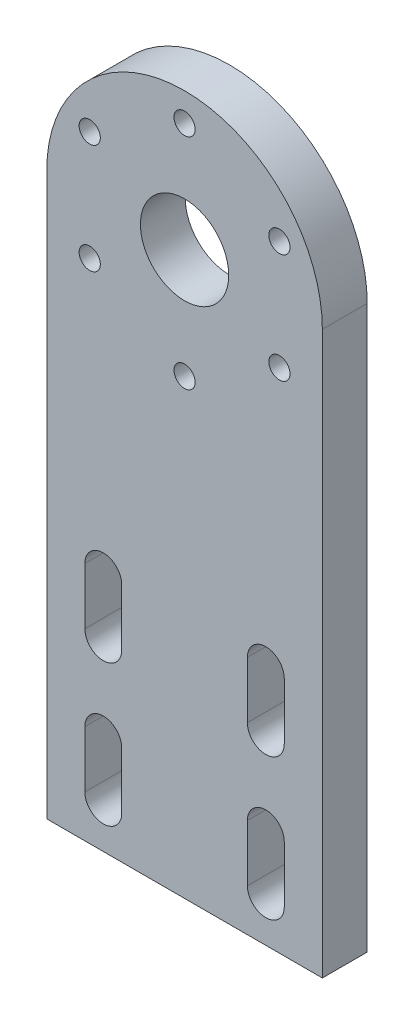
ISO-10303-21;
HEADER;
FILE_DESCRIPTION(('STEP AP214'),'2;1');
FILE_NAME('part.step','',(''),(''),'','','');
FILE_SCHEMA(('AUTOMOTIVE_DESIGN { 1 0 10303 214 1 1 1 1 }'));
ENDSEC;
DATA;
#1=APPLICATION_CONTEXT('core data for automotive mechanical design processes');
#2=APPLICATION_PROTOCOL_DEFINITION('international standard','automotive_design',2000,#1);
#3=PRODUCT_CONTEXT('',#1,'mechanical');
#4=PRODUCT('Part','Part','',(#3));
#5=PRODUCT_RELATED_PRODUCT_CATEGORY('part','',(#4));
#6=PRODUCT_DEFINITION_FORMATION('','',#4);
#7=PRODUCT_DEFINITION_CONTEXT('part definition',#1,'design');
#8=PRODUCT_DEFINITION('design','',#6,#7);
#9=PRODUCT_DEFINITION_SHAPE('','',#8);
#10=(LENGTH_UNIT() NAMED_UNIT(*) SI_UNIT(.MILLI.,.METRE.));
#11=(NAMED_UNIT(*) PLANE_ANGLE_UNIT() SI_UNIT($,.RADIAN.));
#12=(NAMED_UNIT(*) SI_UNIT($,.STERADIAN.) SOLID_ANGLE_UNIT());
#13=UNCERTAINTY_MEASURE_WITH_UNIT(LENGTH_MEASURE(1.E-05),#10,'distance_accuracy_value','');
#14=(GEOMETRIC_REPRESENTATION_CONTEXT(3) GLOBAL_UNCERTAINTY_ASSIGNED_CONTEXT((#13)) GLOBAL_UNIT_ASSIGNED_CONTEXT((#10,
#11,#12)) REPRESENTATION_CONTEXT('',''));
#15=CARTESIAN_POINT('',(0.,0.,0.));
#16=DIRECTION('',(0.,0.,1.));
#17=DIRECTION('',(1.,0.,0.));
#18=AXIS2_PLACEMENT_3D('',#15,#16,#17);
#19=CARTESIAN_POINT('',(0.,0.,6.34999999999999));
#20=DIRECTION('',(0.,0.,-1.));
#21=DIRECTION('',(-1.,0.,0.));
#22=AXIS2_PLACEMENT_3D('',#19,#20,#21);
#23=CYLINDRICAL_SURFACE('',#22,19.5);
#24=CARTESIAN_POINT('',(0.,0.,0.));
#25=DIRECTION('',(0.,0.,1.));
#26=DIRECTION('',(1.,0.,0.));
#27=AXIS2_PLACEMENT_3D('',#24,#25,#26);
#28=CIRCLE('',#27,19.5);
#29=CARTESIAN_POINT('',(19.5,0.,0.));
#30=VERTEX_POINT('',#29);
#31=CARTESIAN_POINT('',(-19.5,0.,0.));
#32=VERTEX_POINT('',#31);
#33=EDGE_CURVE('E316',#30,#32,#28,.T.);
#34=ORIENTED_EDGE('',*,*,#33,.T.);
#35=DIRECTION('',(0.,0.,-1.));
#36=VECTOR('',#35,1.);
#37=CARTESIAN_POINT('',(-19.5,0.,6.34999999999999));
#38=LINE('',#37,#36);
#39=CARTESIAN_POINT('',(-19.5,0.,6.34999999999999));
#40=VERTEX_POINT('',#39);
#41=EDGE_CURVE('E13',#40,#32,#38,.T.);
#42=ORIENTED_EDGE('',*,*,#41,.F.);
#43=CARTESIAN_POINT('',(0.,0.,6.34999999999999));
#44=DIRECTION('',(0.,0.,1.));
#45=DIRECTION('',(1.,0.,0.));
#46=AXIS2_PLACEMENT_3D('',#43,#44,#45);
#47=CIRCLE('',#46,19.5);
#48=CARTESIAN_POINT('',(19.5,0.,6.34999999999999));
#49=VERTEX_POINT('',#48);
#50=EDGE_CURVE('E317',#49,#40,#47,.T.);
#51=ORIENTED_EDGE('',*,*,#50,.F.);
#52=DIRECTION('',(0.,0.,-1.));
#53=VECTOR('',#52,1.);
#54=CARTESIAN_POINT('',(19.5,0.,6.34999999999999));
#55=LINE('',#54,#53);
#56=EDGE_CURVE('E327',#49,#30,#55,.T.);
#57=ORIENTED_EDGE('',*,*,#56,.T.);
#58=EDGE_LOOP('',(#34,#42,#51,#57));
#59=FACE_BOUND('',#58,.T.);
#60=ADVANCED_FACE('F48',(#59),#23,.T.);
#61=CARTESIAN_POINT('',(-19.5,0.,6.34999999999999));
#62=DIRECTION('',(1.,0.,0.));
#63=DIRECTION('',(0.,1.,0.));
#64=AXIS2_PLACEMENT_3D('',#61,#62,#63);
#65=PLANE('',#64);
#66=DIRECTION('',(0.,-1.,0.));
#67=VECTOR('',#66,1.);
#68=CARTESIAN_POINT('',(-19.5,0.,0.));
#69=LINE('',#68,#67);
#70=CARTESIAN_POINT('',(-19.5,-79.5,0.));
#71=VERTEX_POINT('',#70);
#72=EDGE_CURVE('E330',#32,#71,#69,.T.);
#73=ORIENTED_EDGE('',*,*,#72,.T.);
#74=DIRECTION('',(0.,0.,-1.));
#75=VECTOR('',#74,1.);
#76=CARTESIAN_POINT('',(-19.5,-79.5,6.34999999999999));
#77=LINE('',#76,#75);
#78=CARTESIAN_POINT('',(-19.5,-79.5,6.34999999999999));
#79=VERTEX_POINT('',#78);
#80=EDGE_CURVE('E55',#79,#71,#77,.T.);
#81=ORIENTED_EDGE('',*,*,#80,.F.);
#82=DIRECTION('',(0.,-1.,0.));
#83=VECTOR('',#82,1.);
#84=CARTESIAN_POINT('',(-19.5,0.,6.34999999999999));
#85=LINE('',#84,#83);
#86=EDGE_CURVE('E320',#40,#79,#85,.T.);
#87=ORIENTED_EDGE('',*,*,#86,.F.);
#88=ORIENTED_EDGE('',*,*,#41,.T.);
#89=EDGE_LOOP('',(#73,#81,#87,#88));
#90=FACE_BOUND('',#89,.T.);
#91=ADVANCED_FACE('F359',(#90),#65,.F.);
#92=CARTESIAN_POINT('',(19.5,-79.5,6.34999999999999));
#93=DIRECTION('',(0.,1.,0.));
#94=DIRECTION('',(0.,0.,1.));
#95=AXIS2_PLACEMENT_3D('',#92,#93,#94);
#96=PLANE('',#95);
#97=DIRECTION('',(1.,0.,0.));
#98=VECTOR('',#97,1.);
#99=CARTESIAN_POINT('',(19.5,-79.5,0.));
#100=LINE('',#99,#98);
#101=CARTESIAN_POINT('',(19.5,-79.5,0.));
#102=VERTEX_POINT('',#101);
#103=EDGE_CURVE('E332',#71,#102,#100,.T.);
#104=ORIENTED_EDGE('',*,*,#103,.T.);
#105=DIRECTION('',(0.,0.,-1.));
#106=VECTOR('',#105,1.);
#107=CARTESIAN_POINT('',(19.5,-79.5,6.34999999999999));
#108=LINE('',#107,#106);
#109=CARTESIAN_POINT('',(19.5,-79.5,6.34999999999999));
#110=VERTEX_POINT('',#109);
#111=EDGE_CURVE('E337',#110,#102,#108,.T.);
#112=ORIENTED_EDGE('',*,*,#111,.F.);
#113=DIRECTION('',(1.,0.,0.));
#114=VECTOR('',#113,1.);
#115=CARTESIAN_POINT('',(19.5,-79.5,6.34999999999999));
#116=LINE('',#115,#114);
#117=EDGE_CURVE('E323',#79,#110,#116,.T.);
#118=ORIENTED_EDGE('',*,*,#117,.F.);
#119=ORIENTED_EDGE('',*,*,#80,.T.);
#120=EDGE_LOOP('',(#104,#112,#118,#119));
#121=FACE_BOUND('',#120,.T.);
#122=ADVANCED_FACE('F344',(#121),#96,.F.);
#123=CARTESIAN_POINT('',(19.5,0.,6.34999999999999));
#124=DIRECTION('',(-1.,0.,0.));
#125=DIRECTION('',(0.,-1.,0.));
#126=AXIS2_PLACEMENT_3D('',#123,#124,#125);
#127=PLANE('',#126);
#128=DIRECTION('',(0.,1.,0.));
#129=VECTOR('',#128,1.);
#130=CARTESIAN_POINT('',(19.5,0.,0.));
#131=LINE('',#130,#129);
#132=EDGE_CURVE('E321',#102,#30,#131,.T.);
#133=ORIENTED_EDGE('',*,*,#132,.T.);
#134=ORIENTED_EDGE('',*,*,#56,.F.);
#135=DIRECTION('',(0.,1.,0.));
#136=VECTOR('',#135,1.);
#137=CARTESIAN_POINT('',(19.5,0.,6.34999999999999));
#138=LINE('',#137,#136);
#139=EDGE_CURVE('E325',#110,#49,#138,.T.);
#140=ORIENTED_EDGE('',*,*,#139,.F.);
#141=ORIENTED_EDGE('',*,*,#111,.T.);
#142=EDGE_LOOP('',(#133,#134,#140,#141));
#143=FACE_BOUND('',#142,.T.);
#144=ADVANCED_FACE('F352',(#143),#127,.F.);
#145=CARTESIAN_POINT('',(0.,0.,6.34999999999999));
#146=DIRECTION('',(0.,0.,1.));
#147=DIRECTION('',(1.,0.,0.));
#148=AXIS2_PLACEMENT_3D('',#145,#146,#147);
#149=PLANE('',#148);
#150=CARTESIAN_POINT('',(13.4233937586587,7.75000000000016,6.34999999999999));
#151=DIRECTION('',(0.,0.,1.));
#152=DIRECTION('',(1.,0.,0.));
#153=AXIS2_PLACEMENT_3D('',#150,#151,#152);
#154=CIRCLE('',#153,1.5);
#155=CARTESIAN_POINT('',(14.9233937586587,7.75000000000016,6.34999999999999));
#156=VERTEX_POINT('',#155);
#157=EDGE_CURVE('E468',#156,#156,#154,.T.);
#158=ORIENTED_EDGE('',*,*,#157,.F.);
#159=EDGE_LOOP('',(#158));
#160=FACE_BOUND('',#159,.T.);
#161=CARTESIAN_POINT('',(13.4233937586589,-7.74999999999988,6.34999999999999));
#162=DIRECTION('',(0.,0.,1.));
#163=DIRECTION('',(1.,0.,0.));
#164=AXIS2_PLACEMENT_3D('',#161,#162,#163);
#165=CIRCLE('',#164,1.5);
#166=CARTESIAN_POINT('',(14.9233937586589,-7.74999999999988,6.34999999999999));
#167=VERTEX_POINT('',#166);
#168=EDGE_CURVE('E470',#167,#167,#165,.T.);
#169=ORIENTED_EDGE('',*,*,#168,.F.);
#170=EDGE_LOOP('',(#169));
#171=FACE_BOUND('',#170,.T.);
#172=CARTESIAN_POINT('',(0.,-15.5,6.34999999999999));
#173=DIRECTION('',(0.,0.,1.));
#174=DIRECTION('',(1.,0.,0.));
#175=AXIS2_PLACEMENT_3D('',#172,#173,#174);
#176=CIRCLE('',#175,1.5);
#177=CARTESIAN_POINT('',(1.5,-15.5,6.34999999999999));
#178=VERTEX_POINT('',#177);
#179=EDGE_CURVE('E478',#178,#178,#176,.T.);
#180=ORIENTED_EDGE('',*,*,#179,.F.);
#181=EDGE_LOOP('',(#180));
#182=FACE_BOUND('',#181,.T.);
#183=CARTESIAN_POINT('',(-13.4233937586588,-7.75000000000006,6.34999999999999));
#184=DIRECTION('',(0.,0.,1.));
#185=DIRECTION('',(1.,0.,0.));
#186=AXIS2_PLACEMENT_3D('',#183,#184,#185);
#187=CIRCLE('',#186,1.5);
#188=CARTESIAN_POINT('',(-11.9233937586588,-7.75000000000006,6.34999999999999));
#189=VERTEX_POINT('',#188);
#190=EDGE_CURVE('E484',#189,#189,#187,.T.);
#191=ORIENTED_EDGE('',*,*,#190,.F.);
#192=EDGE_LOOP('',(#191));
#193=FACE_BOUND('',#192,.T.);
#194=CARTESIAN_POINT('',(-13.4233937586588,7.74999999999997,6.34999999999999));
#195=DIRECTION('',(0.,0.,1.));
#196=DIRECTION('',(1.,0.,0.));
#197=AXIS2_PLACEMENT_3D('',#194,#195,#196);
#198=CIRCLE('',#197,1.5);
#199=CARTESIAN_POINT('',(-11.9233937586588,7.74999999999997,6.34999999999999));
#200=VERTEX_POINT('',#199);
#201=EDGE_CURVE('E490',#200,#200,#198,.T.);
#202=ORIENTED_EDGE('',*,*,#201,.F.);
#203=EDGE_LOOP('',(#202));
#204=FACE_BOUND('',#203,.T.);
#205=CARTESIAN_POINT('',(0.,15.5,6.34999999999999));
#206=DIRECTION('',(0.,0.,1.));
#207=DIRECTION('',(1.,0.,0.));
#208=AXIS2_PLACEMENT_3D('',#205,#206,#207);
#209=CIRCLE('',#208,1.5);
#210=CARTESIAN_POINT('',(1.5,15.5,6.34999999999999));
#211=VERTEX_POINT('',#210);
#212=EDGE_CURVE('E496',#211,#211,#209,.T.);
#213=ORIENTED_EDGE('',*,*,#212,.F.);
#214=EDGE_LOOP('',(#213));
#215=FACE_BOUND('',#214,.T.);
#216=CARTESIAN_POINT('',(0.,0.,6.34999999999999));
#217=DIRECTION('',(0.,0.,1.));
#218=DIRECTION('',(1.,0.,0.));
#219=AXIS2_PLACEMENT_3D('',#216,#217,#218);
#220=CIRCLE('',#219,6.25);
#221=CARTESIAN_POINT('',(6.25,0.,6.34999999999999));
#222=VERTEX_POINT('',#221);
#223=EDGE_CURVE('E502',#222,#222,#220,.T.);
#224=ORIENTED_EDGE('',*,*,#223,.F.);
#225=EDGE_LOOP('',(#224));
#226=FACE_BOUND('',#225,.T.);
#227=CARTESIAN_POINT('',(-11.5,-53.5,6.34999999999999));
#228=DIRECTION('',(0.,0.,1.));
#229=DIRECTION('',(1.,0.,0.));
#230=AXIS2_PLACEMENT_3D('',#227,#228,#229);
#231=CIRCLE('',#230,2.61);
#232=CARTESIAN_POINT('',(-14.11,-53.5,6.34999999999999));
#233=VERTEX_POINT('',#232);
#234=CARTESIAN_POINT('',(-8.89,-53.5,6.34999999999999));
#235=VERTEX_POINT('',#234);
#236=EDGE_CURVE('E62',#233,#235,#231,.T.);
#237=ORIENTED_EDGE('',*,*,#236,.F.);
#238=DIRECTION('',(0.,-1.,0.));
#239=VECTOR('',#238,1.);
#240=CARTESIAN_POINT('',(-14.11,-53.5,6.34999999999999));
#241=LINE('',#240,#239);
#242=CARTESIAN_POINT('',(-14.11,-45.5,6.34999999999999));
#243=VERTEX_POINT('',#242);
#244=EDGE_CURVE('E244',#243,#233,#241,.T.);
#245=ORIENTED_EDGE('',*,*,#244,.F.);
#246=CARTESIAN_POINT('',(-11.5,-45.5,6.34999999999999));
#247=DIRECTION('',(0.,0.,1.));
#248=DIRECTION('',(1.,0.,0.));
#249=AXIS2_PLACEMENT_3D('',#246,#247,#248);
#250=CIRCLE('',#249,2.61);
#251=CARTESIAN_POINT('',(-8.89,-45.5,6.34999999999999));
#252=VERTEX_POINT('',#251);
#253=EDGE_CURVE('E241',#252,#243,#250,.T.);
#254=ORIENTED_EDGE('',*,*,#253,.F.);
#255=DIRECTION('',(0.,1.,0.));
#256=VECTOR('',#255,1.);
#257=CARTESIAN_POINT('',(-8.89,-53.5,6.34999999999999));
#258=LINE('',#257,#256);
#259=EDGE_CURVE('E238',#235,#252,#258,.T.);
#260=ORIENTED_EDGE('',*,*,#259,.F.);
#261=EDGE_LOOP('',(#237,#245,#254,#260));
#262=FACE_BOUND('',#261,.T.);
#263=CARTESIAN_POINT('',(11.5,-73.5,6.34999999999999));
#264=DIRECTION('',(0.,0.,1.));
#265=DIRECTION('',(-1.,0.,0.));
#266=AXIS2_PLACEMENT_3D('',#263,#264,#265);
#267=CIRCLE('',#266,2.61);
#268=CARTESIAN_POINT('',(8.89,-73.5,6.34999999999999));
#269=VERTEX_POINT('',#268);
#270=CARTESIAN_POINT('',(14.11,-73.5,6.34999999999999));
#271=VERTEX_POINT('',#270);
#272=EDGE_CURVE('E70',#269,#271,#267,.T.);
#273=ORIENTED_EDGE('',*,*,#272,.F.);
#274=DIRECTION('',(0.,-1.,0.));
#275=VECTOR('',#274,1.);
#276=CARTESIAN_POINT('',(8.89,-73.5,6.34999999999999));
#277=LINE('',#276,#275);
#278=CARTESIAN_POINT('',(8.89,-65.5,6.34999999999999));
#279=VERTEX_POINT('',#278);
#280=EDGE_CURVE('E273',#279,#269,#277,.T.);
#281=ORIENTED_EDGE('',*,*,#280,.F.);
#282=CARTESIAN_POINT('',(11.5,-65.5,6.34999999999999));
#283=DIRECTION('',(0.,0.,1.));
#284=DIRECTION('',(-1.,0.,0.));
#285=AXIS2_PLACEMENT_3D('',#282,#283,#284);
#286=CIRCLE('',#285,2.61);
#287=CARTESIAN_POINT('',(14.11,-65.5,6.34999999999999));
#288=VERTEX_POINT('',#287);
#289=EDGE_CURVE('E270',#288,#279,#286,.T.);
#290=ORIENTED_EDGE('',*,*,#289,.F.);
#291=DIRECTION('',(0.,1.,0.));
#292=VECTOR('',#291,1.);
#293=CARTESIAN_POINT('',(14.11,-73.5,6.34999999999999));
#294=LINE('',#293,#292);
#295=EDGE_CURVE('E267',#271,#288,#294,.T.);
#296=ORIENTED_EDGE('',*,*,#295,.F.);
#297=EDGE_LOOP('',(#273,#281,#290,#296));
#298=FACE_BOUND('',#297,.T.);
#299=CARTESIAN_POINT('',(11.5,-53.5,6.34999999999999));
#300=DIRECTION('',(0.,0.,1.));
#301=DIRECTION('',(-1.,0.,0.));
#302=AXIS2_PLACEMENT_3D('',#299,#300,#301);
#303=CIRCLE('',#302,2.61);
#304=CARTESIAN_POINT('',(8.89,-53.5,6.34999999999999));
#305=VERTEX_POINT('',#304);
#306=CARTESIAN_POINT('',(14.11,-53.5,6.34999999999999));
#307=VERTEX_POINT('',#306);
#308=EDGE_CURVE('E191',#305,#307,#303,.T.);
#309=ORIENTED_EDGE('',*,*,#308,.F.);
#310=DIRECTION('',(0.,-1.,0.));
#311=VECTOR('',#310,1.);
#312=CARTESIAN_POINT('',(8.89,-53.5,6.34999999999999));
#313=LINE('',#312,#311);
#314=CARTESIAN_POINT('',(8.89,-45.5,6.34999999999999));
#315=VERTEX_POINT('',#314);
#316=EDGE_CURVE('E196',#315,#305,#313,.T.);
#317=ORIENTED_EDGE('',*,*,#316,.F.);
#318=CARTESIAN_POINT('',(11.5,-45.5,6.34999999999999));
#319=DIRECTION('',(0.,0.,1.));
#320=DIRECTION('',(-1.,0.,0.));
#321=AXIS2_PLACEMENT_3D('',#318,#319,#320);
#322=CIRCLE('',#321,2.61);
#323=CARTESIAN_POINT('',(14.11,-45.5,6.34999999999999));
#324=VERTEX_POINT('',#323);
#325=EDGE_CURVE('E219',#324,#315,#322,.T.);
#326=ORIENTED_EDGE('',*,*,#325,.F.);
#327=DIRECTION('',(0.,1.,0.));
#328=VECTOR('',#327,1.);
#329=CARTESIAN_POINT('',(14.11,-53.5,6.34999999999999));
#330=LINE('',#329,#328);
#331=EDGE_CURVE('E212',#307,#324,#330,.T.);
#332=ORIENTED_EDGE('',*,*,#331,.F.);
#333=EDGE_LOOP('',(#309,#317,#326,#332));
#334=FACE_BOUND('',#333,.T.);
#335=CARTESIAN_POINT('',(-11.5,-73.5,6.34999999999999));
#336=DIRECTION('',(0.,0.,1.));
#337=DIRECTION('',(1.,0.,0.));
#338=AXIS2_PLACEMENT_3D('',#335,#336,#337);
#339=CIRCLE('',#338,2.61);
#340=CARTESIAN_POINT('',(-14.11,-73.5,6.34999999999999));
#341=VERTEX_POINT('',#340);
#342=CARTESIAN_POINT('',(-8.89,-73.5,6.34999999999999));
#343=VERTEX_POINT('',#342);
#344=EDGE_CURVE('E293',#341,#343,#339,.T.);
#345=ORIENTED_EDGE('',*,*,#344,.F.);
#346=DIRECTION('',(0.,-1.,0.));
#347=VECTOR('',#346,1.);
#348=CARTESIAN_POINT('',(-14.11,-73.5,6.34999999999999));
#349=LINE('',#348,#347);
#350=CARTESIAN_POINT('',(-14.11,-65.5,6.34999999999999));
#351=VERTEX_POINT('',#350);
#352=EDGE_CURVE('E301',#351,#341,#349,.T.);
#353=ORIENTED_EDGE('',*,*,#352,.F.);
#354=CARTESIAN_POINT('',(-11.5,-65.5,6.34999999999999));
#355=DIRECTION('',(0.,0.,1.));
#356=DIRECTION('',(1.,0.,0.));
#357=AXIS2_PLACEMENT_3D('',#354,#355,#356);
#358=CIRCLE('',#357,2.61);
#359=CARTESIAN_POINT('',(-8.89,-65.5,6.34999999999999));
#360=VERTEX_POINT('',#359);
#361=EDGE_CURVE('E298',#360,#351,#358,.T.);
#362=ORIENTED_EDGE('',*,*,#361,.F.);
#363=DIRECTION('',(0.,1.,0.));
#364=VECTOR('',#363,1.);
#365=CARTESIAN_POINT('',(-8.89,-73.5,6.34999999999999));
#366=LINE('',#365,#364);
#367=EDGE_CURVE('E295',#343,#360,#366,.T.);
#368=ORIENTED_EDGE('',*,*,#367,.F.);
#369=EDGE_LOOP('',(#345,#353,#362,#368));
#370=FACE_BOUND('',#369,.T.);
#371=ORIENTED_EDGE('',*,*,#50,.T.);
#372=ORIENTED_EDGE('',*,*,#86,.T.);
#373=ORIENTED_EDGE('',*,*,#117,.T.);
#374=ORIENTED_EDGE('',*,*,#139,.T.);
#375=EDGE_LOOP('',(#371,#372,#373,#374));
#376=FACE_BOUND('',#375,.T.);
#377=ADVANCED_FACE('F358',(#160,#171,#182,#193,#204,#215,#226,#262,#298,#334,#370,#376),#149,.T.);
#378=CARTESIAN_POINT('',(0.,0.,0.));
#379=DIRECTION('',(0.,0.,1.));
#380=DIRECTION('',(1.,0.,0.));
#381=AXIS2_PLACEMENT_3D('',#378,#379,#380);
#382=PLANE('',#381);
#383=CARTESIAN_POINT('',(13.4233937586587,7.75000000000016,0.));
#384=DIRECTION('',(0.,0.,1.));
#385=DIRECTION('',(1.,0.,0.));
#386=AXIS2_PLACEMENT_3D('',#383,#384,#385);
#387=CIRCLE('',#386,1.5);
#388=CARTESIAN_POINT('',(14.9233937586587,7.75000000000016,0.));
#389=VERTEX_POINT('',#388);
#390=EDGE_CURVE('E465',#389,#389,#387,.T.);
#391=ORIENTED_EDGE('',*,*,#390,.T.);
#392=EDGE_LOOP('',(#391));
#393=FACE_BOUND('',#392,.T.);
#394=CARTESIAN_POINT('',(13.4233937586589,-7.74999999999988,0.));
#395=DIRECTION('',(0.,0.,1.));
#396=DIRECTION('',(1.,0.,0.));
#397=AXIS2_PLACEMENT_3D('',#394,#395,#396);
#398=CIRCLE('',#397,1.5);
#399=CARTESIAN_POINT('',(14.9233937586589,-7.74999999999988,0.));
#400=VERTEX_POINT('',#399);
#401=EDGE_CURVE('E475',#400,#400,#398,.T.);
#402=ORIENTED_EDGE('',*,*,#401,.T.);
#403=EDGE_LOOP('',(#402));
#404=FACE_BOUND('',#403,.T.);
#405=CARTESIAN_POINT('',(0.,-15.5,0.));
#406=DIRECTION('',(0.,0.,1.));
#407=DIRECTION('',(1.,0.,0.));
#408=AXIS2_PLACEMENT_3D('',#405,#406,#407);
#409=CIRCLE('',#408,1.5);
#410=CARTESIAN_POINT('',(1.5,-15.5,0.));
#411=VERTEX_POINT('',#410);
#412=EDGE_CURVE('E481',#411,#411,#409,.T.);
#413=ORIENTED_EDGE('',*,*,#412,.T.);
#414=EDGE_LOOP('',(#413));
#415=FACE_BOUND('',#414,.T.);
#416=CARTESIAN_POINT('',(-13.4233937586588,-7.75000000000006,0.));
#417=DIRECTION('',(0.,0.,1.));
#418=DIRECTION('',(1.,0.,0.));
#419=AXIS2_PLACEMENT_3D('',#416,#417,#418);
#420=CIRCLE('',#419,1.5);
#421=CARTESIAN_POINT('',(-11.9233937586588,-7.75000000000006,0.));
#422=VERTEX_POINT('',#421);
#423=EDGE_CURVE('E487',#422,#422,#420,.T.);
#424=ORIENTED_EDGE('',*,*,#423,.T.);
#425=EDGE_LOOP('',(#424));
#426=FACE_BOUND('',#425,.T.);
#427=CARTESIAN_POINT('',(-13.4233937586588,7.74999999999997,0.));
#428=DIRECTION('',(0.,0.,1.));
#429=DIRECTION('',(1.,0.,0.));
#430=AXIS2_PLACEMENT_3D('',#427,#428,#429);
#431=CIRCLE('',#430,1.5);
#432=CARTESIAN_POINT('',(-11.9233937586588,7.74999999999997,0.));
#433=VERTEX_POINT('',#432);
#434=EDGE_CURVE('E493',#433,#433,#431,.T.);
#435=ORIENTED_EDGE('',*,*,#434,.T.);
#436=EDGE_LOOP('',(#435));
#437=FACE_BOUND('',#436,.T.);
#438=CARTESIAN_POINT('',(0.,15.5,0.));
#439=DIRECTION('',(0.,0.,1.));
#440=DIRECTION('',(1.,0.,0.));
#441=AXIS2_PLACEMENT_3D('',#438,#439,#440);
#442=CIRCLE('',#441,1.5);
#443=CARTESIAN_POINT('',(1.5,15.5,0.));
#444=VERTEX_POINT('',#443);
#445=EDGE_CURVE('E499',#444,#444,#442,.T.);
#446=ORIENTED_EDGE('',*,*,#445,.T.);
#447=EDGE_LOOP('',(#446));
#448=FACE_BOUND('',#447,.T.);
#449=CARTESIAN_POINT('',(0.,0.,0.));
#450=DIRECTION('',(0.,0.,1.));
#451=DIRECTION('',(1.,0.,0.));
#452=AXIS2_PLACEMENT_3D('',#449,#450,#451);
#453=CIRCLE('',#452,6.25);
#454=CARTESIAN_POINT('',(6.25,0.,0.));
#455=VERTEX_POINT('',#454);
#456=EDGE_CURVE('E505',#455,#455,#453,.F.);
#457=ORIENTED_EDGE('',*,*,#456,.F.);
#458=EDGE_LOOP('',(#457));
#459=FACE_BOUND('',#458,.T.);
#460=DIRECTION('',(0.,1.,0.));
#461=VECTOR('',#460,1.);
#462=CARTESIAN_POINT('',(-14.11,-53.5,0.));
#463=LINE('',#462,#461);
#464=CARTESIAN_POINT('',(-14.11,-53.5,0.));
#465=VERTEX_POINT('',#464);
#466=CARTESIAN_POINT('',(-14.11,-45.5,0.));
#467=VERTEX_POINT('',#466);
#468=EDGE_CURVE('E230',#465,#467,#463,.T.);
#469=ORIENTED_EDGE('',*,*,#468,.F.);
#470=CARTESIAN_POINT('',(-11.5,-53.5,0.));
#471=DIRECTION('',(0.,0.,1.));
#472=DIRECTION('',(1.,0.,0.));
#473=AXIS2_PLACEMENT_3D('',#470,#471,#472);
#474=CIRCLE('',#473,2.61);
#475=CARTESIAN_POINT('',(-8.89,-53.5,0.));
#476=VERTEX_POINT('',#475);
#477=EDGE_CURVE('E234',#476,#465,#474,.F.);
#478=ORIENTED_EDGE('',*,*,#477,.F.);
#479=DIRECTION('',(0.,-1.,0.));
#480=VECTOR('',#479,1.);
#481=CARTESIAN_POINT('',(-8.89,-53.5,0.));
#482=LINE('',#481,#480);
#483=CARTESIAN_POINT('',(-8.89,-45.5,0.));
#484=VERTEX_POINT('',#483);
#485=EDGE_CURVE('E250',#484,#476,#482,.T.);
#486=ORIENTED_EDGE('',*,*,#485,.F.);
#487=CARTESIAN_POINT('',(-11.5,-45.5,0.));
#488=DIRECTION('',(0.,0.,1.));
#489=DIRECTION('',(1.,0.,0.));
#490=AXIS2_PLACEMENT_3D('',#487,#488,#489);
#491=CIRCLE('',#490,2.61);
#492=EDGE_CURVE('E228',#467,#484,#491,.F.);
#493=ORIENTED_EDGE('',*,*,#492,.F.);
#494=EDGE_LOOP('',(#469,#478,#486,#493));
#495=FACE_BOUND('',#494,.T.);
#496=DIRECTION('',(0.,1.,0.));
#497=VECTOR('',#496,1.);
#498=CARTESIAN_POINT('',(8.89,-73.5,0.));
#499=LINE('',#498,#497);
#500=CARTESIAN_POINT('',(8.89,-73.5,0.));
#501=VERTEX_POINT('',#500);
#502=CARTESIAN_POINT('',(8.89,-65.5,0.));
#503=VERTEX_POINT('',#502);
#504=EDGE_CURVE('E260',#501,#503,#499,.T.);
#505=ORIENTED_EDGE('',*,*,#504,.F.);
#506=CARTESIAN_POINT('',(11.5,-73.5,0.));
#507=DIRECTION('',(0.,0.,1.));
#508=DIRECTION('',(1.,0.,0.));
#509=AXIS2_PLACEMENT_3D('',#506,#507,#508);
#510=CIRCLE('',#509,2.61);
#511=CARTESIAN_POINT('',(14.11,-73.5,0.));
#512=VERTEX_POINT('',#511);
#513=EDGE_CURVE('E263',#512,#501,#510,.F.);
#514=ORIENTED_EDGE('',*,*,#513,.F.);
#515=DIRECTION('',(0.,-1.,0.));
#516=VECTOR('',#515,1.);
#517=CARTESIAN_POINT('',(14.11,-73.5,0.));
#518=LINE('',#517,#516);
#519=CARTESIAN_POINT('',(14.11,-65.5,0.));
#520=VERTEX_POINT('',#519);
#521=EDGE_CURVE('E231',#520,#512,#518,.T.);
#522=ORIENTED_EDGE('',*,*,#521,.F.);
#523=CARTESIAN_POINT('',(11.5,-65.5,0.));
#524=DIRECTION('',(0.,0.,1.));
#525=DIRECTION('',(1.,0.,0.));
#526=AXIS2_PLACEMENT_3D('',#523,#524,#525);
#527=CIRCLE('',#526,2.61);
#528=EDGE_CURVE('E204',#503,#520,#527,.F.);
#529=ORIENTED_EDGE('',*,*,#528,.F.);
#530=EDGE_LOOP('',(#505,#514,#522,#529));
#531=FACE_BOUND('',#530,.T.);
#532=DIRECTION('',(0.,1.,0.));
#533=VECTOR('',#532,1.);
#534=CARTESIAN_POINT('',(8.89,-53.5,0.));
#535=LINE('',#534,#533);
#536=CARTESIAN_POINT('',(8.89,-53.5,0.));
#537=VERTEX_POINT('',#536);
#538=CARTESIAN_POINT('',(8.89,-45.5,0.));
#539=VERTEX_POINT('',#538);
#540=EDGE_CURVE('E210',#537,#539,#535,.T.);
#541=ORIENTED_EDGE('',*,*,#540,.F.);
#542=CARTESIAN_POINT('',(11.5,-53.5,0.));
#543=DIRECTION('',(0.,0.,1.));
#544=DIRECTION('',(1.,0.,0.));
#545=AXIS2_PLACEMENT_3D('',#542,#543,#544);
#546=CIRCLE('',#545,2.61);
#547=CARTESIAN_POINT('',(14.11,-53.5,0.));
#548=VERTEX_POINT('',#547);
#549=EDGE_CURVE('E188',#548,#537,#546,.F.);
#550=ORIENTED_EDGE('',*,*,#549,.F.);
#551=DIRECTION('',(0.,-1.,0.));
#552=VECTOR('',#551,1.);
#553=CARTESIAN_POINT('',(14.11,-53.5,0.));
#554=LINE('',#553,#552);
#555=CARTESIAN_POINT('',(14.11,-45.5,0.));
#556=VERTEX_POINT('',#555);
#557=EDGE_CURVE('E200',#556,#548,#554,.T.);
#558=ORIENTED_EDGE('',*,*,#557,.F.);
#559=CARTESIAN_POINT('',(11.5,-45.5,0.));
#560=DIRECTION('',(0.,0.,1.));
#561=DIRECTION('',(1.,0.,0.));
#562=AXIS2_PLACEMENT_3D('',#559,#560,#561);
#563=CIRCLE('',#562,2.61);
#564=EDGE_CURVE('E214',#539,#556,#563,.F.);
#565=ORIENTED_EDGE('',*,*,#564,.F.);
#566=EDGE_LOOP('',(#541,#550,#558,#565));
#567=FACE_BOUND('',#566,.T.);
#568=DIRECTION('',(0.,1.,0.));
#569=VECTOR('',#568,1.);
#570=CARTESIAN_POINT('',(-14.11,-73.5,0.));
#571=LINE('',#570,#569);
#572=CARTESIAN_POINT('',(-14.11,-73.5,0.));
#573=VERTEX_POINT('',#572);
#574=CARTESIAN_POINT('',(-14.11,-65.5,0.));
#575=VERTEX_POINT('',#574);
#576=EDGE_CURVE('E287',#573,#575,#571,.T.);
#577=ORIENTED_EDGE('',*,*,#576,.F.);
#578=CARTESIAN_POINT('',(-11.5,-73.5,0.));
#579=DIRECTION('',(0.,0.,1.));
#580=DIRECTION('',(1.,0.,0.));
#581=AXIS2_PLACEMENT_3D('',#578,#579,#580);
#582=CIRCLE('',#581,2.61);
#583=CARTESIAN_POINT('',(-8.89,-73.5,0.));
#584=VERTEX_POINT('',#583);
#585=EDGE_CURVE('E290',#584,#573,#582,.F.);
#586=ORIENTED_EDGE('',*,*,#585,.F.);
#587=DIRECTION('',(0.,-1.,0.));
#588=VECTOR('',#587,1.);
#589=CARTESIAN_POINT('',(-8.89,-73.5,0.));
#590=LINE('',#589,#588);
#591=CARTESIAN_POINT('',(-8.89,-65.5,0.));
#592=VERTEX_POINT('',#591);
#593=EDGE_CURVE('E307',#592,#584,#590,.T.);
#594=ORIENTED_EDGE('',*,*,#593,.F.);
#595=CARTESIAN_POINT('',(-11.5,-65.5,0.));
#596=DIRECTION('',(0.,0.,1.));
#597=DIRECTION('',(1.,0.,0.));
#598=AXIS2_PLACEMENT_3D('',#595,#596,#597);
#599=CIRCLE('',#598,2.61);
#600=EDGE_CURVE('E258',#575,#592,#599,.F.);
#601=ORIENTED_EDGE('',*,*,#600,.F.);
#602=EDGE_LOOP('',(#577,#586,#594,#601));
#603=FACE_BOUND('',#602,.T.);
#604=ORIENTED_EDGE('',*,*,#33,.F.);
#605=ORIENTED_EDGE('',*,*,#132,.F.);
#606=ORIENTED_EDGE('',*,*,#103,.F.);
#607=ORIENTED_EDGE('',*,*,#72,.F.);
#608=EDGE_LOOP('',(#604,#605,#606,#607));
#609=FACE_BOUND('',#608,.T.);
#610=ADVANCED_FACE('F207',(#393,#404,#415,#426,#437,#448,#459,#495,#531,#567,#603,#609),#382,.F.);
#611=CARTESIAN_POINT('',(-11.5,-73.5,-0.001000000000001));
#612=DIRECTION('',(0.,0.,1.));
#613=DIRECTION('',(1.,0.,0.));
#614=AXIS2_PLACEMENT_3D('',#611,#612,#613);
#615=CYLINDRICAL_SURFACE('',#614,2.61);
#616=ORIENTED_EDGE('',*,*,#585,.T.);
#617=DIRECTION('',(0.,0.,1.));
#618=VECTOR('',#617,1.);
#619=CARTESIAN_POINT('',(-14.11,-73.5,-0.001000000000001));
#620=LINE('',#619,#618);
#621=EDGE_CURVE('E305',#573,#341,#620,.T.);
#622=ORIENTED_EDGE('',*,*,#621,.T.);
#623=ORIENTED_EDGE('',*,*,#344,.T.);
#624=DIRECTION('',(0.,0.,1.));
#625=VECTOR('',#624,1.);
#626=CARTESIAN_POINT('',(-8.89,-73.5,-0.001000000000001));
#627=LINE('',#626,#625);
#628=EDGE_CURVE('E304',#584,#343,#627,.T.);
#629=ORIENTED_EDGE('',*,*,#628,.F.);
#630=EDGE_LOOP('',(#616,#622,#623,#629));
#631=FACE_BOUND('',#630,.T.);
#632=ADVANCED_FACE('F371',(#631),#615,.F.);
#633=CARTESIAN_POINT('',(-14.11,-73.5,-0.001000000000001));
#634=DIRECTION('',(-1.,0.,0.));
#635=DIRECTION('',(0.,-1.,0.));
#636=AXIS2_PLACEMENT_3D('',#633,#634,#635);
#637=PLANE('',#636);
#638=ORIENTED_EDGE('',*,*,#576,.T.);
#639=DIRECTION('',(0.,0.,1.));
#640=VECTOR('',#639,1.);
#641=CARTESIAN_POINT('',(-14.11,-65.5,-0.001000000000001));
#642=LINE('',#641,#640);
#643=EDGE_CURVE('E308',#575,#351,#642,.T.);
#644=ORIENTED_EDGE('',*,*,#643,.T.);
#645=ORIENTED_EDGE('',*,*,#352,.T.);
#646=ORIENTED_EDGE('',*,*,#621,.F.);
#647=EDGE_LOOP('',(#638,#644,#645,#646));
#648=FACE_BOUND('',#647,.T.);
#649=ADVANCED_FACE('F378',(#648),#637,.F.);
#650=CARTESIAN_POINT('',(-11.5,-65.5,-0.001000000000001));
#651=DIRECTION('',(0.,0.,1.));
#652=DIRECTION('',(1.,0.,0.));
#653=AXIS2_PLACEMENT_3D('',#650,#651,#652);
#654=CYLINDRICAL_SURFACE('',#653,2.61);
#655=ORIENTED_EDGE('',*,*,#600,.T.);
#656=DIRECTION('',(0.,0.,1.));
#657=VECTOR('',#656,1.);
#658=CARTESIAN_POINT('',(-8.89,-65.5,-0.001000000000001));
#659=LINE('',#658,#657);
#660=EDGE_CURVE('E310',#592,#360,#659,.T.);
#661=ORIENTED_EDGE('',*,*,#660,.T.);
#662=ORIENTED_EDGE('',*,*,#361,.T.);
#663=ORIENTED_EDGE('',*,*,#643,.F.);
#664=EDGE_LOOP('',(#655,#661,#662,#663));
#665=FACE_BOUND('',#664,.T.);
#666=ADVANCED_FACE('F383',(#665),#654,.F.);
#667=CARTESIAN_POINT('',(-8.89,-73.5,-0.001000000000001));
#668=DIRECTION('',(1.,0.,0.));
#669=DIRECTION('',(0.,1.,0.));
#670=AXIS2_PLACEMENT_3D('',#667,#668,#669);
#671=PLANE('',#670);
#672=ORIENTED_EDGE('',*,*,#593,.T.);
#673=ORIENTED_EDGE('',*,*,#628,.T.);
#674=ORIENTED_EDGE('',*,*,#367,.T.);
#675=ORIENTED_EDGE('',*,*,#660,.F.);
#676=EDGE_LOOP('',(#672,#673,#674,#675));
#677=FACE_BOUND('',#676,.T.);
#678=ADVANCED_FACE('F380',(#677),#671,.F.);
#679=CARTESIAN_POINT('',(11.5,-53.5,-0.001000000000001));
#680=DIRECTION('',(0.,0.,1.));
#681=DIRECTION('',(1.,0.,0.));
#682=AXIS2_PLACEMENT_3D('',#679,#680,#681);
#683=CYLINDRICAL_SURFACE('',#682,2.61);
#684=ORIENTED_EDGE('',*,*,#549,.T.);
#685=DIRECTION('',(0.,0.,1.));
#686=VECTOR('',#685,1.);
#687=CARTESIAN_POINT('',(8.89,-53.5,-0.001000000000001));
#688=LINE('',#687,#686);
#689=EDGE_CURVE('E205',#537,#305,#688,.T.);
#690=ORIENTED_EDGE('',*,*,#689,.T.);
#691=ORIENTED_EDGE('',*,*,#308,.T.);
#692=DIRECTION('',(0.,0.,1.));
#693=VECTOR('',#692,1.);
#694=CARTESIAN_POINT('',(14.11,-53.5,-0.001000000000001));
#695=LINE('',#694,#693);
#696=EDGE_CURVE('E184',#548,#307,#695,.T.);
#697=ORIENTED_EDGE('',*,*,#696,.F.);
#698=EDGE_LOOP('',(#684,#690,#691,#697));
#699=FACE_BOUND('',#698,.T.);
#700=ADVANCED_FACE('F186',(#699),#683,.F.);
#701=CARTESIAN_POINT('',(8.89,-53.5,-0.001000000000001));
#702=DIRECTION('',(-1.,0.,0.));
#703=DIRECTION('',(0.,-1.,0.));
#704=AXIS2_PLACEMENT_3D('',#701,#702,#703);
#705=PLANE('',#704);
#706=ORIENTED_EDGE('',*,*,#540,.T.);
#707=DIRECTION('',(0.,0.,1.));
#708=VECTOR('',#707,1.);
#709=CARTESIAN_POINT('',(8.89,-45.5,-0.001000000000001));
#710=LINE('',#709,#708);
#711=EDGE_CURVE('E225',#539,#315,#710,.T.);
#712=ORIENTED_EDGE('',*,*,#711,.T.);
#713=ORIENTED_EDGE('',*,*,#316,.T.);
#714=ORIENTED_EDGE('',*,*,#689,.F.);
#715=EDGE_LOOP('',(#706,#712,#713,#714));
#716=FACE_BOUND('',#715,.T.);
#717=ADVANCED_FACE('F424',(#716),#705,.F.);
#718=CARTESIAN_POINT('',(11.5,-45.5,-0.001000000000001));
#719=DIRECTION('',(0.,0.,1.));
#720=DIRECTION('',(1.,0.,0.));
#721=AXIS2_PLACEMENT_3D('',#718,#719,#720);
#722=CYLINDRICAL_SURFACE('',#721,2.61);
#723=ORIENTED_EDGE('',*,*,#564,.T.);
#724=DIRECTION('',(0.,0.,1.));
#725=VECTOR('',#724,1.);
#726=CARTESIAN_POINT('',(14.11,-45.5,-0.001000000000001));
#727=LINE('',#726,#725);
#728=EDGE_CURVE('E195',#556,#324,#727,.T.);
#729=ORIENTED_EDGE('',*,*,#728,.T.);
#730=ORIENTED_EDGE('',*,*,#325,.T.);
#731=ORIENTED_EDGE('',*,*,#711,.F.);
#732=EDGE_LOOP('',(#723,#729,#730,#731));
#733=FACE_BOUND('',#732,.T.);
#734=ADVANCED_FACE('F427',(#733),#722,.F.);
#735=CARTESIAN_POINT('',(14.11,-53.5,-0.001000000000001));
#736=DIRECTION('',(1.,0.,0.));
#737=DIRECTION('',(0.,1.,0.));
#738=AXIS2_PLACEMENT_3D('',#735,#736,#737);
#739=PLANE('',#738);
#740=ORIENTED_EDGE('',*,*,#557,.T.);
#741=ORIENTED_EDGE('',*,*,#696,.T.);
#742=ORIENTED_EDGE('',*,*,#331,.T.);
#743=ORIENTED_EDGE('',*,*,#728,.F.);
#744=EDGE_LOOP('',(#740,#741,#742,#743));
#745=FACE_BOUND('',#744,.T.);
#746=ADVANCED_FACE('F201',(#745),#739,.F.);
#747=CARTESIAN_POINT('',(11.5,-73.5,-0.001000000000001));
#748=DIRECTION('',(0.,0.,1.));
#749=DIRECTION('',(1.,0.,0.));
#750=AXIS2_PLACEMENT_3D('',#747,#748,#749);
#751=CYLINDRICAL_SURFACE('',#750,2.61);
#752=ORIENTED_EDGE('',*,*,#513,.T.);
#753=DIRECTION('',(0.,0.,1.));
#754=VECTOR('',#753,1.);
#755=CARTESIAN_POINT('',(8.89,-73.5,-0.001000000000001));
#756=LINE('',#755,#754);
#757=EDGE_CURVE('E277',#501,#269,#756,.T.);
#758=ORIENTED_EDGE('',*,*,#757,.T.);
#759=ORIENTED_EDGE('',*,*,#272,.T.);
#760=DIRECTION('',(0.,0.,1.));
#761=VECTOR('',#760,1.);
#762=CARTESIAN_POINT('',(14.11,-73.5,-0.001000000000001));
#763=LINE('',#762,#761);
#764=EDGE_CURVE('E276',#512,#271,#763,.T.);
#765=ORIENTED_EDGE('',*,*,#764,.F.);
#766=EDGE_LOOP('',(#752,#758,#759,#765));
#767=FACE_BOUND('',#766,.T.);
#768=ADVANCED_FACE('F391',(#767),#751,.F.);
#769=CARTESIAN_POINT('',(8.89,-73.5,-0.001000000000001));
#770=DIRECTION('',(-1.,0.,0.));
#771=DIRECTION('',(0.,-1.,0.));
#772=AXIS2_PLACEMENT_3D('',#769,#770,#771);
#773=PLANE('',#772);
#774=ORIENTED_EDGE('',*,*,#504,.T.);
#775=DIRECTION('',(0.,0.,1.));
#776=VECTOR('',#775,1.);
#777=CARTESIAN_POINT('',(8.89,-65.5,-0.001000000000001));
#778=LINE('',#777,#776);
#779=EDGE_CURVE('E279',#503,#279,#778,.T.);
#780=ORIENTED_EDGE('',*,*,#779,.T.);
#781=ORIENTED_EDGE('',*,*,#280,.T.);
#782=ORIENTED_EDGE('',*,*,#757,.F.);
#783=EDGE_LOOP('',(#774,#780,#781,#782));
#784=FACE_BOUND('',#783,.T.);
#785=ADVANCED_FACE('F394',(#784),#773,.F.);
#786=CARTESIAN_POINT('',(11.5,-65.5,-0.001000000000001));
#787=DIRECTION('',(0.,0.,1.));
#788=DIRECTION('',(1.,0.,0.));
#789=AXIS2_PLACEMENT_3D('',#786,#787,#788);
#790=CYLINDRICAL_SURFACE('',#789,2.61);
#791=ORIENTED_EDGE('',*,*,#528,.T.);
#792=DIRECTION('',(0.,0.,1.));
#793=VECTOR('',#792,1.);
#794=CARTESIAN_POINT('',(14.11,-65.5,-0.001000000000001));
#795=LINE('',#794,#793);
#796=EDGE_CURVE('E281',#520,#288,#795,.T.);
#797=ORIENTED_EDGE('',*,*,#796,.T.);
#798=ORIENTED_EDGE('',*,*,#289,.T.);
#799=ORIENTED_EDGE('',*,*,#779,.F.);
#800=EDGE_LOOP('',(#791,#797,#798,#799));
#801=FACE_BOUND('',#800,.T.);
#802=ADVANCED_FACE('F399',(#801),#790,.F.);
#803=CARTESIAN_POINT('',(14.11,-73.5,-0.001000000000001));
#804=DIRECTION('',(1.,0.,0.));
#805=DIRECTION('',(0.,1.,0.));
#806=AXIS2_PLACEMENT_3D('',#803,#804,#805);
#807=PLANE('',#806);
#808=ORIENTED_EDGE('',*,*,#521,.T.);
#809=ORIENTED_EDGE('',*,*,#764,.T.);
#810=ORIENTED_EDGE('',*,*,#295,.T.);
#811=ORIENTED_EDGE('',*,*,#796,.F.);
#812=EDGE_LOOP('',(#808,#809,#810,#811));
#813=FACE_BOUND('',#812,.T.);
#814=ADVANCED_FACE('F395',(#813),#807,.F.);
#815=CARTESIAN_POINT('',(-11.5,-53.5,-0.001000000000001));
#816=DIRECTION('',(0.,0.,1.));
#817=DIRECTION('',(1.,0.,0.));
#818=AXIS2_PLACEMENT_3D('',#815,#816,#817);
#819=CYLINDRICAL_SURFACE('',#818,2.61);
#820=ORIENTED_EDGE('',*,*,#477,.T.);
#821=DIRECTION('',(0.,0.,1.));
#822=VECTOR('',#821,1.);
#823=CARTESIAN_POINT('',(-14.11,-53.5,-0.001000000000001));
#824=LINE('',#823,#822);
#825=EDGE_CURVE('E248',#465,#233,#824,.T.);
#826=ORIENTED_EDGE('',*,*,#825,.T.);
#827=ORIENTED_EDGE('',*,*,#236,.T.);
#828=DIRECTION('',(0.,0.,1.));
#829=VECTOR('',#828,1.);
#830=CARTESIAN_POINT('',(-8.89,-53.5,-0.001000000000001));
#831=LINE('',#830,#829);
#832=EDGE_CURVE('E247',#476,#235,#831,.T.);
#833=ORIENTED_EDGE('',*,*,#832,.F.);
#834=EDGE_LOOP('',(#820,#826,#827,#833));
#835=FACE_BOUND('',#834,.T.);
#836=ADVANCED_FACE('F398',(#835),#819,.F.);
#837=CARTESIAN_POINT('',(-14.11,-53.5,-0.001000000000001));
#838=DIRECTION('',(-1.,0.,0.));
#839=DIRECTION('',(0.,-1.,0.));
#840=AXIS2_PLACEMENT_3D('',#837,#838,#839);
#841=PLANE('',#840);
#842=ORIENTED_EDGE('',*,*,#468,.T.);
#843=DIRECTION('',(0.,0.,1.));
#844=VECTOR('',#843,1.);
#845=CARTESIAN_POINT('',(-14.11,-45.5,-0.001000000000001));
#846=LINE('',#845,#844);
#847=EDGE_CURVE('E251',#467,#243,#846,.T.);
#848=ORIENTED_EDGE('',*,*,#847,.T.);
#849=ORIENTED_EDGE('',*,*,#244,.T.);
#850=ORIENTED_EDGE('',*,*,#825,.F.);
#851=EDGE_LOOP('',(#842,#848,#849,#850));
#852=FACE_BOUND('',#851,.T.);
#853=ADVANCED_FACE('F409',(#852),#841,.F.);
#854=CARTESIAN_POINT('',(-11.5,-45.5,-0.001000000000001));
#855=DIRECTION('',(0.,0.,1.));
#856=DIRECTION('',(1.,0.,0.));
#857=AXIS2_PLACEMENT_3D('',#854,#855,#856);
#858=CYLINDRICAL_SURFACE('',#857,2.61);
#859=ORIENTED_EDGE('',*,*,#492,.T.);
#860=DIRECTION('',(0.,0.,1.));
#861=VECTOR('',#860,1.);
#862=CARTESIAN_POINT('',(-8.89,-45.5,-0.001000000000001));
#863=LINE('',#862,#861);
#864=EDGE_CURVE('E253',#484,#252,#863,.T.);
#865=ORIENTED_EDGE('',*,*,#864,.T.);
#866=ORIENTED_EDGE('',*,*,#253,.T.);
#867=ORIENTED_EDGE('',*,*,#847,.F.);
#868=EDGE_LOOP('',(#859,#865,#866,#867));
#869=FACE_BOUND('',#868,.T.);
#870=ADVANCED_FACE('F414',(#869),#858,.F.);
#871=CARTESIAN_POINT('',(-8.89,-53.5,-0.001000000000001));
#872=DIRECTION('',(1.,0.,0.));
#873=DIRECTION('',(0.,1.,0.));
#874=AXIS2_PLACEMENT_3D('',#871,#872,#873);
#875=PLANE('',#874);
#876=ORIENTED_EDGE('',*,*,#485,.T.);
#877=ORIENTED_EDGE('',*,*,#832,.T.);
#878=ORIENTED_EDGE('',*,*,#259,.T.);
#879=ORIENTED_EDGE('',*,*,#864,.F.);
#880=EDGE_LOOP('',(#876,#877,#878,#879));
#881=FACE_BOUND('',#880,.T.);
#882=ADVANCED_FACE('F410',(#881),#875,.F.);
#883=CARTESIAN_POINT('',(0.,0.,-0.001000000000001));
#884=DIRECTION('',(0.,0.,1.));
#885=DIRECTION('',(1.,0.,0.));
#886=AXIS2_PLACEMENT_3D('',#883,#884,#885);
#887=CYLINDRICAL_SURFACE('',#886,6.25);
#888=ORIENTED_EDGE('',*,*,#223,.T.);
#889=EDGE_LOOP('',(#888));
#890=FACE_BOUND('',#889,.T.);
#891=ORIENTED_EDGE('',*,*,#456,.T.);
#892=EDGE_LOOP('',(#891));
#893=FACE_BOUND('',#892,.T.);
#894=ADVANCED_FACE('F413',(#890,#893),#887,.F.);
#895=CARTESIAN_POINT('',(0.,15.5,6.34999999999999));
#896=DIRECTION('',(0.,0.,1.));
#897=DIRECTION('',(1.,0.,0.));
#898=AXIS2_PLACEMENT_3D('',#895,#896,#897);
#899=CYLINDRICAL_SURFACE('',#898,1.5);
#900=ORIENTED_EDGE('',*,*,#445,.F.);
#901=EDGE_LOOP('',(#900));
#902=FACE_BOUND('',#901,.T.);
#903=ORIENTED_EDGE('',*,*,#212,.T.);
#904=EDGE_LOOP('',(#903));
#905=FACE_BOUND('',#904,.T.);
#906=ADVANCED_FACE('F436',(#902,#905),#899,.F.);
#907=CARTESIAN_POINT('',(-13.4233937586588,7.74999999999997,6.34999999999999));
#908=DIRECTION('',(0.,0.,1.));
#909=DIRECTION('',(1.,0.,0.));
#910=AXIS2_PLACEMENT_3D('',#907,#908,#909);
#911=CYLINDRICAL_SURFACE('',#910,1.5);
#912=ORIENTED_EDGE('',*,*,#434,.F.);
#913=EDGE_LOOP('',(#912));
#914=FACE_BOUND('',#913,.T.);
#915=ORIENTED_EDGE('',*,*,#201,.T.);
#916=EDGE_LOOP('',(#915));
#917=FACE_BOUND('',#916,.T.);
#918=ADVANCED_FACE('F440',(#914,#917),#911,.F.);
#919=CARTESIAN_POINT('',(-13.4233937586588,-7.75000000000006,6.34999999999999));
#920=DIRECTION('',(0.,0.,1.));
#921=DIRECTION('',(1.,0.,0.));
#922=AXIS2_PLACEMENT_3D('',#919,#920,#921);
#923=CYLINDRICAL_SURFACE('',#922,1.5);
#924=ORIENTED_EDGE('',*,*,#423,.F.);
#925=EDGE_LOOP('',(#924));
#926=FACE_BOUND('',#925,.T.);
#927=ORIENTED_EDGE('',*,*,#190,.T.);
#928=EDGE_LOOP('',(#927));
#929=FACE_BOUND('',#928,.T.);
#930=ADVANCED_FACE('F444',(#926,#929),#923,.F.);
#931=CARTESIAN_POINT('',(0.,-15.5,6.34999999999999));
#932=DIRECTION('',(0.,0.,1.));
#933=DIRECTION('',(1.,0.,0.));
#934=AXIS2_PLACEMENT_3D('',#931,#932,#933);
#935=CYLINDRICAL_SURFACE('',#934,1.5);
#936=ORIENTED_EDGE('',*,*,#412,.F.);
#937=EDGE_LOOP('',(#936));
#938=FACE_BOUND('',#937,.T.);
#939=ORIENTED_EDGE('',*,*,#179,.T.);
#940=EDGE_LOOP('',(#939));
#941=FACE_BOUND('',#940,.T.);
#942=ADVANCED_FACE('F448',(#938,#941),#935,.F.);
#943=CARTESIAN_POINT('',(13.4233937586589,-7.74999999999988,6.34999999999999));
#944=DIRECTION('',(0.,0.,1.));
#945=DIRECTION('',(1.,0.,0.));
#946=AXIS2_PLACEMENT_3D('',#943,#944,#945);
#947=CYLINDRICAL_SURFACE('',#946,1.5);
#948=ORIENTED_EDGE('',*,*,#401,.F.);
#949=EDGE_LOOP('',(#948));
#950=FACE_BOUND('',#949,.T.);
#951=ORIENTED_EDGE('',*,*,#168,.T.);
#952=EDGE_LOOP('',(#951));
#953=FACE_BOUND('',#952,.T.);
#954=ADVANCED_FACE('F452',(#950,#953),#947,.F.);
#955=CARTESIAN_POINT('',(13.4233937586587,7.75000000000016,6.34999999999999));
#956=DIRECTION('',(0.,0.,1.));
#957=DIRECTION('',(1.,0.,0.));
#958=AXIS2_PLACEMENT_3D('',#955,#956,#957);
#959=CYLINDRICAL_SURFACE('',#958,1.5);
#960=ORIENTED_EDGE('',*,*,#390,.F.);
#961=EDGE_LOOP('',(#960));
#962=FACE_BOUND('',#961,.T.);
#963=ORIENTED_EDGE('',*,*,#157,.T.);
#964=EDGE_LOOP('',(#963));
#965=FACE_BOUND('',#964,.T.);
#966=ADVANCED_FACE('F456',(#962,#965),#959,.F.);
#967=CLOSED_SHELL('',(#60,#91,#122,#144,#377,#610,#632,#649,#666,#678,#700,#717,#734,#746,#768,
#785,#802,#814,#836,#853,#870,#882,#894,#906,#918,#930,#942,#954,#966));
#968=MANIFOLD_SOLID_BREP('B2',#967);
#969=ADVANCED_BREP_SHAPE_REPRESENTATION('',(#18,#968),#14);
#970=SHAPE_DEFINITION_REPRESENTATION(#9,#969);
ENDSEC;
END-ISO-10303-21;
